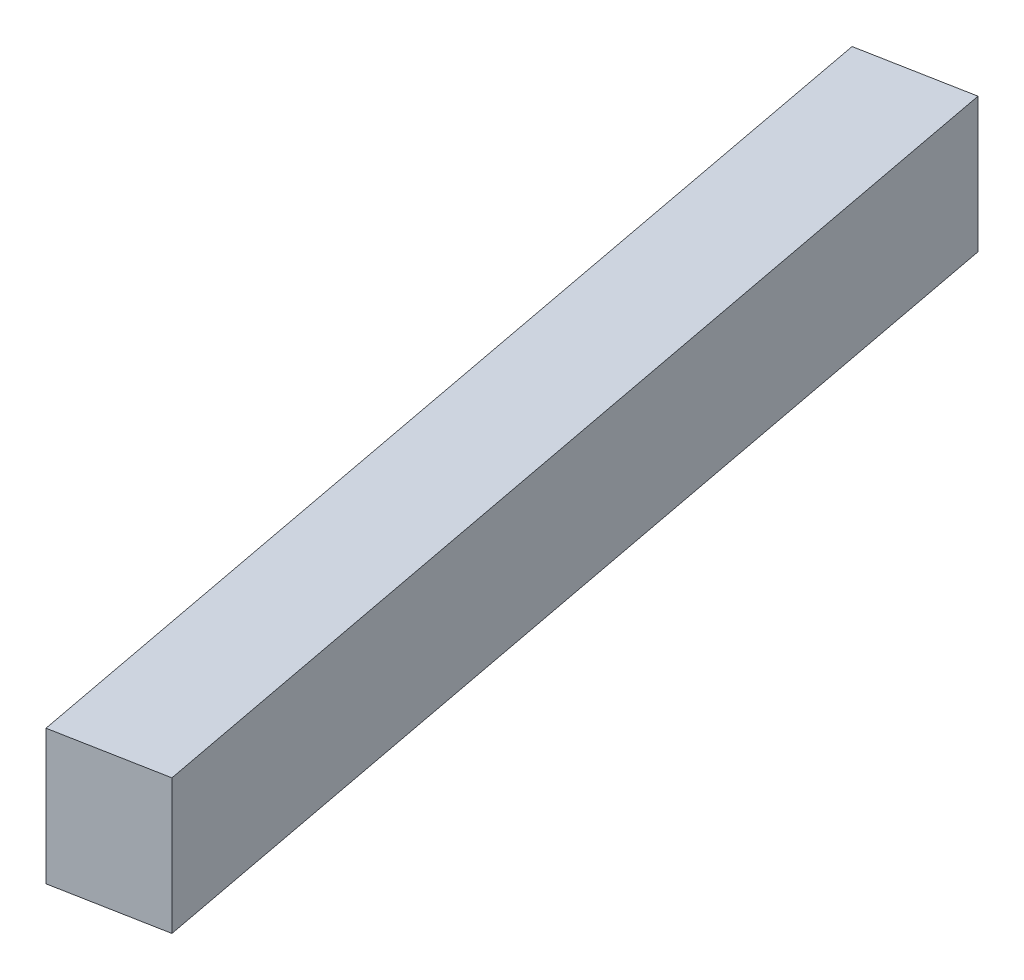
ISO-10303-21;
HEADER;
FILE_DESCRIPTION(('STEP AP214'),'2;1');
FILE_NAME('part.step','',(''),(''),'','','');
FILE_SCHEMA(('AUTOMOTIVE_DESIGN { 1 0 10303 214 1 1 1 1 }'));
ENDSEC;
DATA;
#1=APPLICATION_CONTEXT('core data for automotive mechanical design processes');
#2=APPLICATION_PROTOCOL_DEFINITION('international standard','automotive_design',2000,#1);
#3=PRODUCT_CONTEXT('',#1,'mechanical');
#4=PRODUCT('Part','Part','',(#3));
#5=PRODUCT_RELATED_PRODUCT_CATEGORY('part','',(#4));
#6=PRODUCT_DEFINITION_FORMATION('','',#4);
#7=PRODUCT_DEFINITION_CONTEXT('part definition',#1,'design');
#8=PRODUCT_DEFINITION('design','',#6,#7);
#9=PRODUCT_DEFINITION_SHAPE('','',#8);
#10=(LENGTH_UNIT() NAMED_UNIT(*) SI_UNIT(.MILLI.,.METRE.));
#11=(NAMED_UNIT(*) PLANE_ANGLE_UNIT() SI_UNIT($,.RADIAN.));
#12=(NAMED_UNIT(*) SI_UNIT($,.STERADIAN.) SOLID_ANGLE_UNIT());
#13=UNCERTAINTY_MEASURE_WITH_UNIT(LENGTH_MEASURE(1.E-05),#10,'distance_accuracy_value','');
#14=(GEOMETRIC_REPRESENTATION_CONTEXT(3) GLOBAL_UNCERTAINTY_ASSIGNED_CONTEXT((#13)) GLOBAL_UNIT_ASSIGNED_CONTEXT((#10,
#11,#12)) REPRESENTATION_CONTEXT('',''));
#15=CARTESIAN_POINT('',(0.,0.,0.));
#16=DIRECTION('',(0.,0.,1.));
#17=DIRECTION('',(1.,0.,0.));
#18=AXIS2_PLACEMENT_3D('',#15,#16,#17);
#19=CARTESIAN_POINT('',(-3.43292819589461,7.874,-17.6668857043653));
#20=DIRECTION('',(0.982684014968323,0.,-0.185289305481287));
#21=DIRECTION('',(-0.185289305481287,0.,-0.982684014968323));
#22=AXIS2_PLACEMENT_3D('',#19,#20,#21);
#23=PLANE('',#22);
#24=DIRECTION('',(0.,1.,0.));
#25=VECTOR('',#24,1.);
#26=CARTESIAN_POINT('',(-3.43292819589461,7.874,-17.6668857043653));
#27=LINE('',#26,#25);
#28=CARTESIAN_POINT('',(-3.43292819589461,7.62,-17.6668857043653));
#29=VERTEX_POINT('',#28);
#30=CARTESIAN_POINT('',(-3.43292819589461,7.874,-17.6668857043653));
#31=VERTEX_POINT('',#30);
#32=EDGE_CURVE('E20',#29,#31,#27,.T.);
#33=ORIENTED_EDGE('',*,*,#32,.T.);
#34=DIRECTION('',(0.185289305481282,0.,0.982684014968323));
#35=VECTOR('',#34,1.);
#36=CARTESIAN_POINT('',(-3.78590432283646,7.874,-19.53889875288));
#37=LINE('',#36,#35);
#38=CARTESIAN_POINT('',(-3.78590432283646,7.874,-19.53889875288));
#39=VERTEX_POINT('',#38);
#40=EDGE_CURVE('E55',#39,#31,#37,.T.);
#41=ORIENTED_EDGE('',*,*,#40,.F.);
#42=DIRECTION('',(0.,1.,0.));
#43=VECTOR('',#42,1.);
#44=CARTESIAN_POINT('',(-3.78590432283646,7.874,-19.53889875288));
#45=LINE('',#44,#43);
#46=CARTESIAN_POINT('',(-3.78590432283646,7.62,-19.53889875288));
#47=VERTEX_POINT('',#46);
#48=EDGE_CURVE('E76',#39,#47,#45,.F.);
#49=ORIENTED_EDGE('',*,*,#48,.T.);
#50=DIRECTION('',(0.185289305481282,0.,0.982684014968323));
#51=VECTOR('',#50,1.);
#52=CARTESIAN_POINT('',(-3.78590432283646,7.62,-19.53889875288));
#53=LINE('',#52,#51);
#54=EDGE_CURVE('E58',#47,#29,#53,.T.);
#55=ORIENTED_EDGE('',*,*,#54,.T.);
#56=EDGE_LOOP('',(#33,#41,#49,#55));
#57=FACE_BOUND('',#56,.T.);
#58=ADVANCED_FACE('F17',(#57),#23,.F.);
#59=CARTESIAN_POINT('',(-3.43292819589461,7.874,-17.6668857043653));
#60=DIRECTION('',(-0.185289305481305,0.,-0.982684014968319));
#61=DIRECTION('',(-0.982684014968319,0.,0.185289305481305));
#62=AXIS2_PLACEMENT_3D('',#59,#60,#61);
#63=PLANE('',#62);
#64=DIRECTION('',(0.,1.,0.));
#65=VECTOR('',#64,1.);
#66=CARTESIAN_POINT('',(-3.23324680405304,7.874,-17.7045364912391));
#67=LINE('',#66,#65);
#68=CARTESIAN_POINT('',(-3.23324680405304,7.62,-17.7045364912391));
#69=VERTEX_POINT('',#68);
#70=CARTESIAN_POINT('',(-3.23324680405304,7.874,-17.7045364912391));
#71=VERTEX_POINT('',#70);
#72=EDGE_CURVE('E73',#69,#71,#67,.T.);
#73=ORIENTED_EDGE('',*,*,#72,.T.);
#74=DIRECTION('',(0.982684014968319,0.,-0.185289305481304));
#75=VECTOR('',#74,1.);
#76=CARTESIAN_POINT('',(-3.43292819589461,7.874,-17.6668857043653));
#77=LINE('',#76,#75);
#78=EDGE_CURVE('E63',#31,#71,#77,.T.);
#79=ORIENTED_EDGE('',*,*,#78,.F.);
#80=ORIENTED_EDGE('',*,*,#32,.F.);
#81=DIRECTION('',(0.982684014968319,0.,-0.185289305481304));
#82=VECTOR('',#81,1.);
#83=CARTESIAN_POINT('',(-3.43292819589461,7.62,-17.6668857043653));
#84=LINE('',#83,#82);
#85=EDGE_CURVE('E80',#29,#69,#84,.T.);
#86=ORIENTED_EDGE('',*,*,#85,.T.);
#87=EDGE_LOOP('',(#73,#79,#80,#86));
#88=FACE_BOUND('',#87,.T.);
#89=ADVANCED_FACE('F72',(#88),#63,.F.);
#90=CARTESIAN_POINT('',(-3.23324680405304,7.874,-17.7045364912391));
#91=DIRECTION('',(0.,1.,0.));
#92=DIRECTION('',(0.,0.,1.));
#93=AXIS2_PLACEMENT_3D('',#90,#91,#92);
#94=PLANE('',#93);
#95=DIRECTION('',(0.982684014686255,0.,-0.185289306977234));
#96=VECTOR('',#95,1.);
#97=CARTESIAN_POINT('',(-3.78590432283646,7.874,-19.53889875288));
#98=LINE('',#97,#96);
#99=CARTESIAN_POINT('',(-3.58622293105221,7.874,-19.5765495400578));
#100=VERTEX_POINT('',#99);
#101=EDGE_CURVE('E69',#100,#39,#98,.F.);
#102=ORIENTED_EDGE('',*,*,#101,.T.);
#103=ORIENTED_EDGE('',*,*,#40,.T.);
#104=ORIENTED_EDGE('',*,*,#78,.T.);
#105=DIRECTION('',(0.185289305481289,0.,0.982684014968322));
#106=VECTOR('',#105,1.);
#107=CARTESIAN_POINT('',(-3.23324680405304,7.874,-17.7045364912391));
#108=LINE('',#107,#106);
#109=EDGE_CURVE('E83',#71,#100,#108,.F.);
#110=ORIENTED_EDGE('',*,*,#109,.T.);
#111=EDGE_LOOP('',(#102,#103,#104,#110));
#112=FACE_BOUND('',#111,.T.);
#113=ADVANCED_FACE('F66',(#112),#94,.T.);
#114=CARTESIAN_POINT('',(-3.78590432283646,7.874,-19.53889875288));
#115=DIRECTION('',(0.185289306977234,0.,0.982684014686255));
#116=DIRECTION('',(0.982684014686255,0.,-0.185289306977234));
#117=AXIS2_PLACEMENT_3D('',#114,#115,#116);
#118=PLANE('',#117);
#119=ORIENTED_EDGE('',*,*,#48,.F.);
#120=ORIENTED_EDGE('',*,*,#101,.F.);
#121=DIRECTION('',(0.,1.,0.));
#122=VECTOR('',#121,1.);
#123=CARTESIAN_POINT('',(-3.58622293105222,7.874,-19.5765495400578));
#124=LINE('',#123,#122);
#125=CARTESIAN_POINT('',(-3.58622293105221,7.62,-19.5765495400578));
#126=VERTEX_POINT('',#125);
#127=EDGE_CURVE('E26',#100,#126,#124,.F.);
#128=ORIENTED_EDGE('',*,*,#127,.T.);
#129=DIRECTION('',(-0.98268401468623,0.,0.185289306977366));
#130=VECTOR('',#129,1.);
#131=CARTESIAN_POINT('',(-3.58622293105221,7.62,-19.5765495400578));
#132=LINE('',#131,#130);
#133=EDGE_CURVE('E34',#126,#47,#132,.T.);
#134=ORIENTED_EDGE('',*,*,#133,.T.);
#135=EDGE_LOOP('',(#119,#120,#128,#134));
#136=FACE_BOUND('',#135,.T.);
#137=ADVANCED_FACE('F88',(#136),#118,.F.);
#138=CARTESIAN_POINT('',(-3.23324680405304,7.62,-17.7045364912391));
#139=DIRECTION('',(0.,1.,0.));
#140=DIRECTION('',(0.,0.,1.));
#141=AXIS2_PLACEMENT_3D('',#138,#139,#140);
#142=PLANE('',#141);
#143=ORIENTED_EDGE('',*,*,#54,.F.);
#144=ORIENTED_EDGE('',*,*,#133,.F.);
#145=DIRECTION('',(0.185289305481289,0.,0.982684014968322));
#146=VECTOR('',#145,1.);
#147=CARTESIAN_POINT('',(-3.23324680405304,7.62,-17.7045364912391));
#148=LINE('',#147,#146);
#149=EDGE_CURVE('E11',#126,#69,#148,.T.);
#150=ORIENTED_EDGE('',*,*,#149,.T.);
#151=ORIENTED_EDGE('',*,*,#85,.F.);
#152=EDGE_LOOP('',(#143,#144,#150,#151));
#153=FACE_BOUND('',#152,.T.);
#154=ADVANCED_FACE('F91',(#153),#142,.F.);
#155=CARTESIAN_POINT('',(-3.23324680405304,7.874,-17.7045364912391));
#156=DIRECTION('',(-0.982684014968322,0.,0.185289305481289));
#157=DIRECTION('',(0.185289305481289,0.,0.982684014968322));
#158=AXIS2_PLACEMENT_3D('',#155,#156,#157);
#159=PLANE('',#158);
#160=ORIENTED_EDGE('',*,*,#127,.F.);
#161=ORIENTED_EDGE('',*,*,#109,.F.);
#162=ORIENTED_EDGE('',*,*,#72,.F.);
#163=ORIENTED_EDGE('',*,*,#149,.F.);
#164=EDGE_LOOP('',(#160,#161,#162,#163));
#165=FACE_BOUND('',#164,.T.);
#166=ADVANCED_FACE('F90',(#165),#159,.F.);
#167=CLOSED_SHELL('',(#58,#89,#113,#137,#154,#166));
#168=MANIFOLD_SOLID_BREP('B1',#167);
#169=ADVANCED_BREP_SHAPE_REPRESENTATION('',(#18,#168),#14);
#170=SHAPE_DEFINITION_REPRESENTATION(#9,#169);
ENDSEC;
END-ISO-10303-21;
